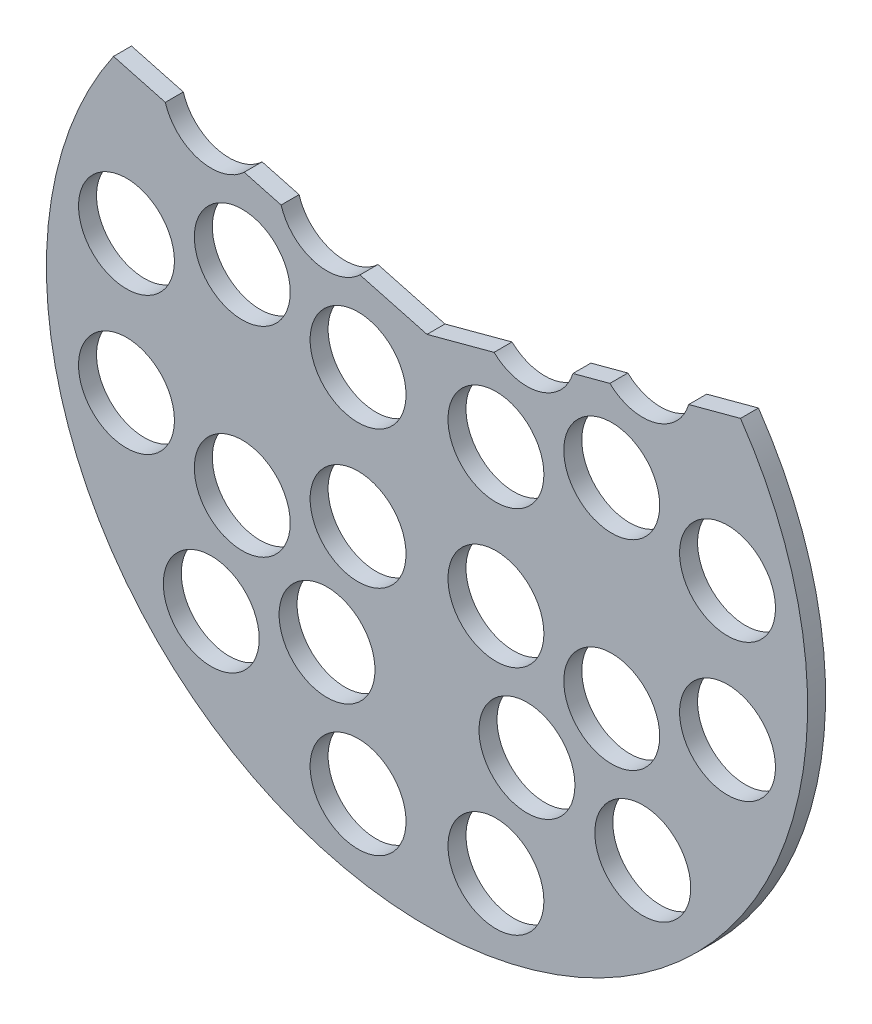
ISO-10303-21;
HEADER;
FILE_DESCRIPTION(('STEP AP214'),'2;1');
FILE_NAME('part.step','',(''),(''),'','','');
FILE_SCHEMA(('AUTOMOTIVE_DESIGN { 1 0 10303 214 1 1 1 1 }'));
ENDSEC;
DATA;
#1=APPLICATION_CONTEXT('core data for automotive mechanical design processes');
#2=APPLICATION_PROTOCOL_DEFINITION('international standard','automotive_design',2000,#1);
#3=PRODUCT_CONTEXT('',#1,'mechanical');
#4=PRODUCT('Part','Part','',(#3));
#5=PRODUCT_RELATED_PRODUCT_CATEGORY('part','',(#4));
#6=PRODUCT_DEFINITION_FORMATION('','',#4);
#7=PRODUCT_DEFINITION_CONTEXT('part definition',#1,'design');
#8=PRODUCT_DEFINITION('design','',#6,#7);
#9=PRODUCT_DEFINITION_SHAPE('','',#8);
#10=(LENGTH_UNIT() NAMED_UNIT(*) SI_UNIT(.MILLI.,.METRE.));
#11=(NAMED_UNIT(*) PLANE_ANGLE_UNIT() SI_UNIT($,.RADIAN.));
#12=(NAMED_UNIT(*) SI_UNIT($,.STERADIAN.) SOLID_ANGLE_UNIT());
#13=UNCERTAINTY_MEASURE_WITH_UNIT(LENGTH_MEASURE(1.E-05),#10,'distance_accuracy_value','');
#14=(GEOMETRIC_REPRESENTATION_CONTEXT(3) GLOBAL_UNCERTAINTY_ASSIGNED_CONTEXT((#13)) GLOBAL_UNIT_ASSIGNED_CONTEXT((#10,
#11,#12)) REPRESENTATION_CONTEXT('',''));
#15=CARTESIAN_POINT('',(0.,0.,0.));
#16=DIRECTION('',(0.,0.,1.));
#17=DIRECTION('',(1.,0.,0.));
#18=AXIS2_PLACEMENT_3D('',#15,#16,#17);
#19=CARTESIAN_POINT('',(0.,0.,1.5));
#20=DIRECTION('',(0.,0.,1.));
#21=DIRECTION('',(1.,0.,0.));
#22=AXIS2_PLACEMENT_3D('',#19,#20,#21);
#23=PLANE('',#22);
#24=CARTESIAN_POINT('',(-25.0684769508544,5.74996042511669,1.5));
#25=DIRECTION('',(0.,0.,1.));
#26=DIRECTION('',(1.,0.,0.));
#27=AXIS2_PLACEMENT_3D('',#24,#25,#26);
#28=CIRCLE('',#27,3.99999999999999);
#29=CARTESIAN_POINT('',(-21.0684769508544,5.74996042511669,1.5));
#30=VERTEX_POINT('',#29);
#31=EDGE_CURVE('E216',#30,#30,#28,.T.);
#32=ORIENTED_EDGE('',*,*,#31,.F.);
#33=EDGE_LOOP('',(#32));
#34=FACE_BOUND('',#33,.T.);
#35=CARTESIAN_POINT('',(-15.4092186879601,8.33815087612825,1.5));
#36=DIRECTION('',(0.,0.,1.));
#37=DIRECTION('',(1.,0.,0.));
#38=AXIS2_PLACEMENT_3D('',#35,#36,#37);
#39=CIRCLE('',#38,4.);
#40=CARTESIAN_POINT('',(-11.4092186879601,8.33815087612825,1.5));
#41=VERTEX_POINT('',#40);
#42=EDGE_CURVE('E220',#41,#41,#39,.T.);
#43=ORIENTED_EDGE('',*,*,#42,.F.);
#44=EDGE_LOOP('',(#43));
#45=FACE_BOUND('',#44,.T.);
#46=CARTESIAN_POINT('',(-5.74992085018606,-25.0685165257759,1.5));
#47=DIRECTION('',(0.,0.,1.));
#48=DIRECTION('',(1.,0.,0.));
#49=AXIS2_PLACEMENT_3D('',#46,#47,#48);
#50=CIRCLE('',#49,4.00000000000001);
#51=CARTESIAN_POINT('',(-1.74992085018605,-25.0685165257759,1.5));
#52=VERTEX_POINT('',#51);
#53=EDGE_CURVE('E224',#52,#52,#50,.T.);
#54=ORIENTED_EDGE('',*,*,#53,.F.);
#55=EDGE_LOOP('',(#54));
#56=FACE_BOUND('',#55,.T.);
#57=CARTESIAN_POINT('',(-15.409179113061,-8.33819045101063,1.5));
#58=DIRECTION('',(0.,0.,1.));
#59=DIRECTION('',(1.,0.,0.));
#60=AXIS2_PLACEMENT_3D('',#57,#58,#59);
#61=CIRCLE('',#60,3.99999999999999);
#62=CARTESIAN_POINT('',(-11.409179113061,-8.33819045101063,1.5));
#63=VERTEX_POINT('',#62);
#64=EDGE_CURVE('E228',#63,#63,#61,.T.);
#65=ORIENTED_EDGE('',*,*,#64,.F.);
#66=EDGE_LOOP('',(#65));
#67=FACE_BOUND('',#66,.T.);
#68=CARTESIAN_POINT('',(-8.33811130120218,-15.4092582628828,1.5));
#69=DIRECTION('',(0.,0.,1.));
#70=DIRECTION('',(1.,0.,0.));
#71=AXIS2_PLACEMENT_3D('',#68,#69,#70);
#72=CIRCLE('',#71,4.);
#73=CARTESIAN_POINT('',(-4.33811130120218,-15.4092582628828,1.5));
#74=VERTEX_POINT('',#73);
#75=EDGE_CURVE('E232',#74,#74,#72,.T.);
#76=ORIENTED_EDGE('',*,*,#75,.F.);
#77=EDGE_LOOP('',(#76));
#78=FACE_BOUND('',#77,.T.);
#79=CARTESIAN_POINT('',(25.0685561006974,-5.74996042509303,1.5));
#80=DIRECTION('',(0.,0.,1.));
#81=DIRECTION('',(1.,0.,0.));
#82=AXIS2_PLACEMENT_3D('',#79,#80,#81);
#83=CIRCLE('',#82,4.00000000000003);
#84=CARTESIAN_POINT('',(29.0685561006975,-5.74996042509303,1.5));
#85=VERTEX_POINT('',#84);
#86=EDGE_CURVE('E236',#85,#85,#83,.T.);
#87=ORIENTED_EDGE('',*,*,#86,.F.);
#88=EDGE_LOOP('',(#87));
#89=FACE_BOUND('',#88,.T.);
#90=CARTESIAN_POINT('',(8.3382300259367,-15.4092186879758,1.5));
#91=DIRECTION('',(0.,0.,1.));
#92=DIRECTION('',(1.,0.,0.));
#93=AXIS2_PLACEMENT_3D('',#90,#91,#92);
#94=CIRCLE('',#93,4.);
#95=CARTESIAN_POINT('',(12.3382300259367,-15.4092186879758,1.5));
#96=VERTEX_POINT('',#95);
#97=EDGE_CURVE('E240',#96,#96,#94,.T.);
#98=ORIENTED_EDGE('',*,*,#97,.F.);
#99=EDGE_LOOP('',(#98));
#100=FACE_BOUND('',#99,.T.);
#101=CARTESIAN_POINT('',(15.4092978378055,-8.33815087611371,1.5));
#102=DIRECTION('',(0.,0.,1.));
#103=DIRECTION('',(1.,0.,0.));
#104=AXIS2_PLACEMENT_3D('',#101,#102,#103);
#105=CIRCLE('',#104,3.99999999999999);
#106=CARTESIAN_POINT('',(19.4092978378055,-8.33815087611371,1.5));
#107=VERTEX_POINT('',#106);
#108=EDGE_CURVE('E244',#107,#107,#105,.T.);
#109=ORIENTED_EDGE('',*,*,#108,.F.);
#110=EDGE_LOOP('',(#109));
#111=FACE_BOUND('',#110,.T.);
#112=CARTESIAN_POINT('',(15.4092582628907,8.33819045102517,1.5));
#113=DIRECTION('',(0.,0.,1.));
#114=DIRECTION('',(1.,0.,0.));
#115=AXIS2_PLACEMENT_3D('',#112,#113,#114);
#116=CIRCLE('',#115,3.99999999999999);
#117=CARTESIAN_POINT('',(19.4092582628907,8.33819045102517,1.5));
#118=VERTEX_POINT('',#117);
#119=EDGE_CURVE('E175',#118,#118,#116,.T.);
#120=ORIENTED_EDGE('',*,*,#119,.F.);
#121=EDGE_LOOP('',(#120));
#122=FACE_BOUND('',#121,.T.);
#123=CARTESIAN_POINT('',(5.75,5.75,1.5));
#124=DIRECTION('',(0.,0.,1.));
#125=DIRECTION('',(1.,0.,0.));
#126=AXIS2_PLACEMENT_3D('',#123,#124,#125);
#127=CIRCLE('',#126,4.);
#128=CARTESIAN_POINT('',(9.75,5.75,1.5));
#129=VERTEX_POINT('',#128);
#130=EDGE_CURVE('E152',#129,#129,#127,.T.);
#131=ORIENTED_EDGE('',*,*,#130,.F.);
#132=EDGE_LOOP('',(#131));
#133=FACE_BOUND('',#132,.T.);
#134=CARTESIAN_POINT('',(25.0685165257814,5.75,1.5));
#135=DIRECTION('',(0.,0.,1.));
#136=DIRECTION('',(1.,0.,0.));
#137=AXIS2_PLACEMENT_3D('',#134,#135,#136);
#138=CIRCLE('',#137,4.00000000000003);
#139=CARTESIAN_POINT('',(29.0685165257814,5.75,1.5));
#140=VERTEX_POINT('',#139);
#141=EDGE_CURVE('E252',#140,#140,#138,.T.);
#142=ORIENTED_EDGE('',*,*,#141,.F.);
#143=EDGE_LOOP('',(#142));
#144=FACE_BOUND('',#143,.T.);
#145=CARTESIAN_POINT('',(5.75003957491608,-5.74996042508392,1.5));
#146=DIRECTION('',(0.,0.,1.));
#147=DIRECTION('',(1.,0.,0.));
#148=AXIS2_PLACEMENT_3D('',#145,#146,#147);
#149=CIRCLE('',#148,3.99999999999999);
#150=CARTESIAN_POINT('',(9.75003957491608,-5.74996042508392,1.5));
#151=VERTEX_POINT('',#150);
#152=EDGE_CURVE('E256',#151,#151,#149,.T.);
#153=ORIENTED_EDGE('',*,*,#152,.F.);
#154=EDGE_LOOP('',(#153));
#155=FACE_BOUND('',#154,.T.);
#156=CARTESIAN_POINT('',(17.9974882888262,-17.9974091390056,1.5));
#157=DIRECTION('',(0.,0.,1.));
#158=DIRECTION('',(1.,0.,0.));
#159=AXIS2_PLACEMENT_3D('',#156,#157,#158);
#160=CIRCLE('',#159,3.99999999999999);
#161=CARTESIAN_POINT('',(21.9974882888261,-17.9974091390056,1.5));
#162=VERTEX_POINT('',#161);
#163=EDGE_CURVE('E260',#162,#162,#160,.T.);
#164=ORIENTED_EDGE('',*,*,#163,.F.);
#165=EDGE_LOOP('',(#164));
#166=FACE_BOUND('',#165,.T.);
#167=CARTESIAN_POINT('',(5.75003957490697,-25.0684769508653,1.5));
#168=DIRECTION('',(0.,0.,1.));
#169=DIRECTION('',(1.,0.,0.));
#170=AXIS2_PLACEMENT_3D('',#167,#168,#169);
#171=CIRCLE('',#170,4.00000000000001);
#172=CARTESIAN_POINT('',(9.75003957490698,-25.0684769508653,1.5));
#173=VERTEX_POINT('',#172);
#174=EDGE_CURVE('E264',#173,#173,#171,.T.);
#175=ORIENTED_EDGE('',*,*,#174,.F.);
#176=EDGE_LOOP('',(#175));
#177=FACE_BOUND('',#176,.T.);
#178=CARTESIAN_POINT('',(-5.74992085016783,-5.74999999999457,1.5));
#179=DIRECTION('',(0.,0.,1.));
#180=DIRECTION('',(1.,0.,0.));
#181=AXIS2_PLACEMENT_3D('',#178,#179,#180);
#182=CIRCLE('',#181,4.);
#183=CARTESIAN_POINT('',(-1.74992085016783,-5.74999999999457,1.5));
#184=VERTEX_POINT('',#183);
#185=EDGE_CURVE('E268',#184,#184,#182,.T.);
#186=ORIENTED_EDGE('',*,*,#185,.F.);
#187=EDGE_LOOP('',(#186));
#188=FACE_BOUND('',#187,.T.);
#189=CARTESIAN_POINT('',(-17.9973695640953,-17.9974487138989,1.5));
#190=DIRECTION('',(0.,0.,1.));
#191=DIRECTION('',(1.,0.,0.));
#192=AXIS2_PLACEMENT_3D('',#189,#190,#191);
#193=CIRCLE('',#192,4.);
#194=CARTESIAN_POINT('',(-13.9973695640953,-17.9974487138989,1.5));
#195=VERTEX_POINT('',#194);
#196=EDGE_CURVE('E272',#195,#195,#193,.T.);
#197=ORIENTED_EDGE('',*,*,#196,.F.);
#198=EDGE_LOOP('',(#197));
#199=FACE_BOUND('',#198,.T.);
#200=CARTESIAN_POINT('',(-25.0684373759492,-5.74999999997635,1.5));
#201=DIRECTION('',(0.,0.,1.));
#202=DIRECTION('',(1.,0.,0.));
#203=AXIS2_PLACEMENT_3D('',#200,#201,#202);
#204=CIRCLE('',#203,3.99999999999999);
#205=CARTESIAN_POINT('',(-21.0684373759492,-5.74999999997635,1.5));
#206=VERTEX_POINT('',#205);
#207=EDGE_CURVE('E276',#206,#206,#204,.T.);
#208=ORIENTED_EDGE('',*,*,#207,.F.);
#209=EDGE_LOOP('',(#208));
#210=FACE_BOUND('',#209,.T.);
#211=CARTESIAN_POINT('',(-5.74996042507306,5.74996042508934,1.5));
#212=DIRECTION('',(0.,0.,1.));
#213=DIRECTION('',(1.,0.,0.));
#214=AXIS2_PLACEMENT_3D('',#211,#212,#213);
#215=CIRCLE('',#214,4.);
#216=CARTESIAN_POINT('',(-1.74996042507306,5.74996042508934,1.5));
#217=VERTEX_POINT('',#216);
#218=EDGE_CURVE('E279',#217,#217,#215,.T.);
#219=ORIENTED_EDGE('',*,*,#218,.F.);
#220=EDGE_LOOP('',(#219));
#221=FACE_BOUND('',#220,.T.);
#222=CARTESIAN_POINT('',(-8.33815087608457,15.4092186879837,1.5));
#223=DIRECTION('',(0.,0.,1.));
#224=DIRECTION('',(1.,0.,0.));
#225=AXIS2_PLACEMENT_3D('',#222,#223,#224);
#226=CIRCLE('',#225,4.);
#227=CARTESIAN_POINT('',(-12.1697718795866,14.2608805472247,1.5));
#228=VERTEX_POINT('',#227);
#229=CARTESIAN_POINT('',(-5.59403881976548,12.498918184193,1.5));
#230=VERTEX_POINT('',#229);
#231=EDGE_CURVE('E399',#228,#230,#226,.T.);
#232=ORIENTED_EDGE('',*,*,#231,.F.);
#233=DIRECTION('',(0.965925826288701,-0.258819045103891,0.));
#234=VECTOR('',#233,1.);
#235=CARTESIAN_POINT('',(-26.1498802743356,18.0068393017185,1.5));
#236=LINE('',#235,#234);
#237=CARTESIAN_POINT('',(-15.2532970826525,15.0871086352319,1.5));
#238=VERTEX_POINT('',#237);
#239=EDGE_CURVE('E141',#238,#228,#236,.T.);
#240=ORIENTED_EDGE('',*,*,#239,.F.);
#241=CARTESIAN_POINT('',(-17.9974091389716,17.9974091390226,1.5));
#242=DIRECTION('',(0.,0.,1.));
#243=DIRECTION('',(1.,0.,0.));
#244=AXIS2_PLACEMENT_3D('',#241,#242,#243);
#245=CIRCLE('',#244,4.);
#246=CARTESIAN_POINT('',(-21.8290301424737,16.8490709982636,1.5));
#247=VERTEX_POINT('',#246);
#248=EDGE_CURVE('E139',#247,#238,#245,.T.);
#249=ORIENTED_EDGE('',*,*,#248,.F.);
#250=CARTESIAN_POINT('',(-26.1498802743356,18.0068393017185,1.5));
#251=VERTEX_POINT('',#250);
#252=EDGE_CURVE('E120',#251,#247,#236,.T.);
#253=ORIENTED_EDGE('',*,*,#252,.F.);
#254=CARTESIAN_POINT('',(0.,0.,1.5));
#255=DIRECTION('',(0.,0.,1.));
#256=DIRECTION('',(1.,0.,0.));
#257=AXIS2_PLACEMENT_3D('',#254,#255,#256);
#258=CIRCLE('',#257,31.75);
#259=CARTESIAN_POINT('',(26.1498802743588,18.0068393016849,1.5));
#260=VERTEX_POINT('',#259);
#261=EDGE_CURVE('E136',#251,#260,#258,.T.);
#262=ORIENTED_EDGE('',*,*,#261,.T.);
#263=DIRECTION('',(0.965925826289069,0.258819045102517,0.));
#264=VECTOR('',#263,1.);
#265=CARTESIAN_POINT('',(0.,11.,1.5));
#266=LINE('',#265,#264);
#267=CARTESIAN_POINT('',(21.8290602765594,16.8490790726343,1.5));
#268=VERTEX_POINT('',#267);
#269=EDGE_CURVE('E140',#268,#260,#266,.T.);
#270=ORIENTED_EDGE('',*,*,#269,.F.);
#271=CARTESIAN_POINT('',(17.9974487139159,17.9974487139158,1.5));
#272=DIRECTION('',(0.,0.,1.));
#273=DIRECTION('',(1.,0.,0.));
#274=AXIS2_PLACEMENT_3D('',#271,#272,#273);
#275=CIRCLE('',#274,3.99999999999999);
#276=CARTESIAN_POINT('',(15.2533605838733,15.0871256503095,1.5));
#277=VERTEX_POINT('',#276);
#278=EDGE_CURVE('E164',#277,#268,#275,.T.);
#279=ORIENTED_EDGE('',*,*,#278,.F.);
#280=CARTESIAN_POINT('',(12.1698020136687,14.2608886216091,1.5));
#281=VERTEX_POINT('',#280);
#282=EDGE_CURVE('E58',#281,#277,#266,.T.);
#283=ORIENTED_EDGE('',*,*,#282,.F.);
#284=CARTESIAN_POINT('',(8.33819045102524,15.4092582628907,1.5));
#285=DIRECTION('',(0.,0.,1.));
#286=DIRECTION('',(1.,0.,0.));
#287=AXIS2_PLACEMENT_3D('',#284,#285,#286);
#288=CIRCLE('',#287,4.00000000000001);
#289=CARTESIAN_POINT('',(5.59410232098258,12.4989351992843,1.5));
#290=VERTEX_POINT('',#289);
#291=EDGE_CURVE('E173',#290,#281,#288,.T.);
#292=ORIENTED_EDGE('',*,*,#291,.F.);
#293=CARTESIAN_POINT('',(0.,11.,1.5));
#294=VERTEX_POINT('',#293);
#295=EDGE_CURVE('E373',#294,#290,#266,.T.);
#296=ORIENTED_EDGE('',*,*,#295,.F.);
#297=EDGE_CURVE('E143',#230,#294,#236,.T.);
#298=ORIENTED_EDGE('',*,*,#297,.F.);
#299=EDGE_LOOP('',(#232,#240,#249,#253,#262,#270,#279,#283,#292,#296,#298));
#300=FACE_BOUND('',#299,.T.);
#301=ADVANCED_FACE('F36',(#34,#45,#56,#67,#78,#89,#100,#111,#122,#133,#144,#155,#166,#177,#188,
#199,#210,#221,#300),#23,.T.);
#302=CARTESIAN_POINT('',(0.,0.,0.));
#303=DIRECTION('',(0.,0.,1.));
#304=DIRECTION('',(1.,0.,0.));
#305=AXIS2_PLACEMENT_3D('',#302,#303,#304);
#306=PLANE('',#305);
#307=CARTESIAN_POINT('',(-25.0684769508544,5.74996042511669,0.));
#308=DIRECTION('',(0.,0.,1.));
#309=DIRECTION('',(1.,0.,0.));
#310=AXIS2_PLACEMENT_3D('',#307,#308,#309);
#311=CIRCLE('',#310,3.99999999999999);
#312=CARTESIAN_POINT('',(-21.0684769508544,5.74996042511669,0.));
#313=VERTEX_POINT('',#312);
#314=EDGE_CURVE('E394',#313,#313,#311,.T.);
#315=ORIENTED_EDGE('',*,*,#314,.T.);
#316=EDGE_LOOP('',(#315));
#317=FACE_BOUND('',#316,.T.);
#318=CARTESIAN_POINT('',(-15.4092186879601,8.33815087612825,0.));
#319=DIRECTION('',(0.,0.,1.));
#320=DIRECTION('',(1.,0.,0.));
#321=AXIS2_PLACEMENT_3D('',#318,#319,#320);
#322=CIRCLE('',#321,4.);
#323=CARTESIAN_POINT('',(-11.4092186879601,8.33815087612825,0.));
#324=VERTEX_POINT('',#323);
#325=EDGE_CURVE('E289',#324,#324,#322,.T.);
#326=ORIENTED_EDGE('',*,*,#325,.T.);
#327=EDGE_LOOP('',(#326));
#328=FACE_BOUND('',#327,.T.);
#329=CARTESIAN_POINT('',(-5.74996042507306,5.74996042508934,0.));
#330=DIRECTION('',(0.,0.,1.));
#331=DIRECTION('',(1.,0.,0.));
#332=AXIS2_PLACEMENT_3D('',#329,#330,#331);
#333=CIRCLE('',#332,4.);
#334=CARTESIAN_POINT('',(-1.74996042507306,5.74996042508934,0.));
#335=VERTEX_POINT('',#334);
#336=EDGE_CURVE('E282',#335,#335,#333,.T.);
#337=ORIENTED_EDGE('',*,*,#336,.T.);
#338=EDGE_LOOP('',(#337));
#339=FACE_BOUND('',#338,.T.);
#340=CARTESIAN_POINT('',(-5.74992085018606,-25.0685165257759,0.));
#341=DIRECTION('',(0.,0.,1.));
#342=DIRECTION('',(1.,0.,0.));
#343=AXIS2_PLACEMENT_3D('',#340,#341,#342);
#344=CIRCLE('',#343,4.00000000000001);
#345=CARTESIAN_POINT('',(-1.74992085018605,-25.0685165257759,0.));
#346=VERTEX_POINT('',#345);
#347=EDGE_CURVE('E281',#346,#346,#344,.T.);
#348=ORIENTED_EDGE('',*,*,#347,.T.);
#349=EDGE_LOOP('',(#348));
#350=FACE_BOUND('',#349,.T.);
#351=CARTESIAN_POINT('',(-25.0684373759492,-5.74999999997635,0.));
#352=DIRECTION('',(0.,0.,1.));
#353=DIRECTION('',(1.,0.,0.));
#354=AXIS2_PLACEMENT_3D('',#351,#352,#353);
#355=CIRCLE('',#354,3.99999999999999);
#356=CARTESIAN_POINT('',(-21.0684373759492,-5.74999999997635,0.));
#357=VERTEX_POINT('',#356);
#358=EDGE_CURVE('E292',#357,#357,#355,.T.);
#359=ORIENTED_EDGE('',*,*,#358,.T.);
#360=EDGE_LOOP('',(#359));
#361=FACE_BOUND('',#360,.T.);
#362=CARTESIAN_POINT('',(-15.409179113061,-8.33819045101063,0.));
#363=DIRECTION('',(0.,0.,1.));
#364=DIRECTION('',(1.,0.,0.));
#365=AXIS2_PLACEMENT_3D('',#362,#363,#364);
#366=CIRCLE('',#365,3.99999999999999);
#367=CARTESIAN_POINT('',(-11.409179113061,-8.33819045101063,0.));
#368=VERTEX_POINT('',#367);
#369=EDGE_CURVE('E295',#368,#368,#366,.T.);
#370=ORIENTED_EDGE('',*,*,#369,.T.);
#371=EDGE_LOOP('',(#370));
#372=FACE_BOUND('',#371,.T.);
#373=CARTESIAN_POINT('',(-17.9973695640953,-17.9974487138989,0.));
#374=DIRECTION('',(0.,0.,1.));
#375=DIRECTION('',(1.,0.,0.));
#376=AXIS2_PLACEMENT_3D('',#373,#374,#375);
#377=CIRCLE('',#376,4.);
#378=CARTESIAN_POINT('',(-13.9973695640953,-17.9974487138989,0.));
#379=VERTEX_POINT('',#378);
#380=EDGE_CURVE('E299',#379,#379,#377,.T.);
#381=ORIENTED_EDGE('',*,*,#380,.T.);
#382=EDGE_LOOP('',(#381));
#383=FACE_BOUND('',#382,.T.);
#384=CARTESIAN_POINT('',(-8.33811130120218,-15.4092582628828,0.));
#385=DIRECTION('',(0.,0.,1.));
#386=DIRECTION('',(1.,0.,0.));
#387=AXIS2_PLACEMENT_3D('',#384,#385,#386);
#388=CIRCLE('',#387,4.);
#389=CARTESIAN_POINT('',(-4.33811130120218,-15.4092582628828,0.));
#390=VERTEX_POINT('',#389);
#391=EDGE_CURVE('E303',#390,#390,#388,.T.);
#392=ORIENTED_EDGE('',*,*,#391,.T.);
#393=EDGE_LOOP('',(#392));
#394=FACE_BOUND('',#393,.T.);
#395=CARTESIAN_POINT('',(-5.74992085016783,-5.74999999999457,0.));
#396=DIRECTION('',(0.,0.,1.));
#397=DIRECTION('',(1.,0.,0.));
#398=AXIS2_PLACEMENT_3D('',#395,#396,#397);
#399=CIRCLE('',#398,4.);
#400=CARTESIAN_POINT('',(-1.74992085016783,-5.74999999999457,0.));
#401=VERTEX_POINT('',#400);
#402=EDGE_CURVE('E307',#401,#401,#399,.T.);
#403=ORIENTED_EDGE('',*,*,#402,.T.);
#404=EDGE_LOOP('',(#403));
#405=FACE_BOUND('',#404,.T.);
#406=CARTESIAN_POINT('',(25.0685561006974,-5.74996042509303,0.));
#407=DIRECTION('',(0.,0.,1.));
#408=DIRECTION('',(1.,0.,0.));
#409=AXIS2_PLACEMENT_3D('',#406,#407,#408);
#410=CIRCLE('',#409,4.00000000000003);
#411=CARTESIAN_POINT('',(29.0685561006975,-5.74996042509303,0.));
#412=VERTEX_POINT('',#411);
#413=EDGE_CURVE('E311',#412,#412,#410,.T.);
#414=ORIENTED_EDGE('',*,*,#413,.T.);
#415=EDGE_LOOP('',(#414));
#416=FACE_BOUND('',#415,.T.);
#417=CARTESIAN_POINT('',(5.75003957490697,-25.0684769508653,0.));
#418=DIRECTION('',(0.,0.,1.));
#419=DIRECTION('',(1.,0.,0.));
#420=AXIS2_PLACEMENT_3D('',#417,#418,#419);
#421=CIRCLE('',#420,4.00000000000001);
#422=CARTESIAN_POINT('',(9.75003957490698,-25.0684769508653,0.));
#423=VERTEX_POINT('',#422);
#424=EDGE_CURVE('E315',#423,#423,#421,.T.);
#425=ORIENTED_EDGE('',*,*,#424,.T.);
#426=EDGE_LOOP('',(#425));
#427=FACE_BOUND('',#426,.T.);
#428=CARTESIAN_POINT('',(8.3382300259367,-15.4092186879758,0.));
#429=DIRECTION('',(0.,0.,1.));
#430=DIRECTION('',(1.,0.,0.));
#431=AXIS2_PLACEMENT_3D('',#428,#429,#430);
#432=CIRCLE('',#431,4.);
#433=CARTESIAN_POINT('',(12.3382300259367,-15.4092186879758,0.));
#434=VERTEX_POINT('',#433);
#435=EDGE_CURVE('E319',#434,#434,#432,.T.);
#436=ORIENTED_EDGE('',*,*,#435,.T.);
#437=EDGE_LOOP('',(#436));
#438=FACE_BOUND('',#437,.T.);
#439=CARTESIAN_POINT('',(17.9974882888262,-17.9974091390056,0.));
#440=DIRECTION('',(0.,0.,1.));
#441=DIRECTION('',(1.,0.,0.));
#442=AXIS2_PLACEMENT_3D('',#439,#440,#441);
#443=CIRCLE('',#442,3.99999999999999);
#444=CARTESIAN_POINT('',(21.9974882888261,-17.9974091390056,0.));
#445=VERTEX_POINT('',#444);
#446=EDGE_CURVE('E323',#445,#445,#443,.T.);
#447=ORIENTED_EDGE('',*,*,#446,.T.);
#448=EDGE_LOOP('',(#447));
#449=FACE_BOUND('',#448,.T.);
#450=CARTESIAN_POINT('',(15.4092978378055,-8.33815087611371,0.));
#451=DIRECTION('',(0.,0.,1.));
#452=DIRECTION('',(1.,0.,0.));
#453=AXIS2_PLACEMENT_3D('',#450,#451,#452);
#454=CIRCLE('',#453,3.99999999999999);
#455=CARTESIAN_POINT('',(19.4092978378055,-8.33815087611371,0.));
#456=VERTEX_POINT('',#455);
#457=EDGE_CURVE('E327',#456,#456,#454,.T.);
#458=ORIENTED_EDGE('',*,*,#457,.T.);
#459=EDGE_LOOP('',(#458));
#460=FACE_BOUND('',#459,.T.);
#461=CARTESIAN_POINT('',(5.75003957491608,-5.74996042508392,0.));
#462=DIRECTION('',(0.,0.,1.));
#463=DIRECTION('',(1.,0.,0.));
#464=AXIS2_PLACEMENT_3D('',#461,#462,#463);
#465=CIRCLE('',#464,3.99999999999999);
#466=CARTESIAN_POINT('',(9.75003957491608,-5.74996042508392,0.));
#467=VERTEX_POINT('',#466);
#468=EDGE_CURVE('E331',#467,#467,#465,.T.);
#469=ORIENTED_EDGE('',*,*,#468,.T.);
#470=EDGE_LOOP('',(#469));
#471=FACE_BOUND('',#470,.T.);
#472=CARTESIAN_POINT('',(25.0685165257814,5.75,0.));
#473=DIRECTION('',(0.,0.,1.));
#474=DIRECTION('',(1.,0.,0.));
#475=AXIS2_PLACEMENT_3D('',#472,#473,#474);
#476=CIRCLE('',#475,4.00000000000003);
#477=CARTESIAN_POINT('',(29.0685165257814,5.75,0.));
#478=VERTEX_POINT('',#477);
#479=EDGE_CURVE('E335',#478,#478,#476,.T.);
#480=ORIENTED_EDGE('',*,*,#479,.T.);
#481=EDGE_LOOP('',(#480));
#482=FACE_BOUND('',#481,.T.);
#483=CARTESIAN_POINT('',(15.4092582628907,8.33819045102517,0.));
#484=DIRECTION('',(0.,0.,1.));
#485=DIRECTION('',(1.,0.,0.));
#486=AXIS2_PLACEMENT_3D('',#483,#484,#485);
#487=CIRCLE('',#486,3.99999999999999);
#488=CARTESIAN_POINT('',(19.4092582628907,8.33819045102517,0.));
#489=VERTEX_POINT('',#488);
#490=EDGE_CURVE('E178',#489,#489,#487,.T.);
#491=ORIENTED_EDGE('',*,*,#490,.T.);
#492=EDGE_LOOP('',(#491));
#493=FACE_BOUND('',#492,.T.);
#494=CARTESIAN_POINT('',(5.75,5.75,0.));
#495=DIRECTION('',(0.,0.,1.));
#496=DIRECTION('',(1.,0.,0.));
#497=AXIS2_PLACEMENT_3D('',#494,#495,#496);
#498=CIRCLE('',#497,4.);
#499=CARTESIAN_POINT('',(9.75,5.75,0.));
#500=VERTEX_POINT('',#499);
#501=EDGE_CURVE('E155',#500,#500,#498,.T.);
#502=ORIENTED_EDGE('',*,*,#501,.T.);
#503=EDGE_LOOP('',(#502));
#504=FACE_BOUND('',#503,.T.);
#505=DIRECTION('',(0.965925826288701,-0.258819045103891,0.));
#506=VECTOR('',#505,1.);
#507=CARTESIAN_POINT('',(-26.1498802743356,18.0068393017185,0.));
#508=LINE('',#507,#506);
#509=CARTESIAN_POINT('',(-15.2532970826525,15.0871086352319,0.));
#510=VERTEX_POINT('',#509);
#511=CARTESIAN_POINT('',(-12.1697718795866,14.2608805472247,0.));
#512=VERTEX_POINT('',#511);
#513=EDGE_CURVE('E629',#510,#512,#508,.T.);
#514=ORIENTED_EDGE('',*,*,#513,.T.);
#515=CARTESIAN_POINT('',(-8.33815087608457,15.4092186879837,0.));
#516=DIRECTION('',(0.,0.,1.));
#517=DIRECTION('',(1.,0.,0.));
#518=AXIS2_PLACEMENT_3D('',#515,#516,#517);
#519=CIRCLE('',#518,4.);
#520=CARTESIAN_POINT('',(-5.59403881976548,12.498918184193,0.));
#521=VERTEX_POINT('',#520);
#522=EDGE_CURVE('E396',#512,#521,#519,.T.);
#523=ORIENTED_EDGE('',*,*,#522,.T.);
#524=CARTESIAN_POINT('',(0.,11.,0.));
#525=VERTEX_POINT('',#524);
#526=EDGE_CURVE('E627',#521,#525,#508,.T.);
#527=ORIENTED_EDGE('',*,*,#526,.T.);
#528=DIRECTION('',(0.965925826289069,0.258819045102517,0.));
#529=VECTOR('',#528,1.);
#530=CARTESIAN_POINT('',(0.,11.,0.));
#531=LINE('',#530,#529);
#532=CARTESIAN_POINT('',(5.59410232098258,12.4989351992843,0.));
#533=VERTEX_POINT('',#532);
#534=EDGE_CURVE('E384',#525,#533,#531,.T.);
#535=ORIENTED_EDGE('',*,*,#534,.T.);
#536=CARTESIAN_POINT('',(8.33819045102524,15.4092582628907,0.));
#537=DIRECTION('',(0.,0.,1.));
#538=DIRECTION('',(1.,0.,0.));
#539=AXIS2_PLACEMENT_3D('',#536,#537,#538);
#540=CIRCLE('',#539,4.00000000000001);
#541=CARTESIAN_POINT('',(12.1698020136687,14.2608886216091,0.));
#542=VERTEX_POINT('',#541);
#543=EDGE_CURVE('E170',#533,#542,#540,.T.);
#544=ORIENTED_EDGE('',*,*,#543,.T.);
#545=CARTESIAN_POINT('',(15.2533605838733,15.0871256503095,0.));
#546=VERTEX_POINT('',#545);
#547=EDGE_CURVE('E382',#542,#546,#531,.T.);
#548=ORIENTED_EDGE('',*,*,#547,.T.);
#549=CARTESIAN_POINT('',(17.9974487139159,17.9974487139158,0.));
#550=DIRECTION('',(0.,0.,1.));
#551=DIRECTION('',(1.,0.,0.));
#552=AXIS2_PLACEMENT_3D('',#549,#550,#551);
#553=CIRCLE('',#552,3.99999999999999);
#554=CARTESIAN_POINT('',(21.8290602765594,16.8490790726343,0.));
#555=VERTEX_POINT('',#554);
#556=EDGE_CURVE('E166',#546,#555,#553,.T.);
#557=ORIENTED_EDGE('',*,*,#556,.T.);
#558=CARTESIAN_POINT('',(26.1498802743588,18.0068393016849,0.));
#559=VERTEX_POINT('',#558);
#560=EDGE_CURVE('E51',#555,#559,#531,.T.);
#561=ORIENTED_EDGE('',*,*,#560,.T.);
#562=CARTESIAN_POINT('',(0.,0.,0.));
#563=DIRECTION('',(0.,0.,1.));
#564=DIRECTION('',(1.,0.,0.));
#565=AXIS2_PLACEMENT_3D('',#562,#563,#564);
#566=CIRCLE('',#565,31.75);
#567=CARTESIAN_POINT('',(-26.1498802743356,18.0068393017185,0.));
#568=VERTEX_POINT('',#567);
#569=EDGE_CURVE('E147',#568,#559,#566,.T.);
#570=ORIENTED_EDGE('',*,*,#569,.F.);
#571=CARTESIAN_POINT('',(-21.8290301424737,16.8490709982636,0.));
#572=VERTEX_POINT('',#571);
#573=EDGE_CURVE('E123',#568,#572,#508,.T.);
#574=ORIENTED_EDGE('',*,*,#573,.T.);
#575=CARTESIAN_POINT('',(-17.9974091389716,17.9974091390226,0.));
#576=DIRECTION('',(0.,0.,1.));
#577=DIRECTION('',(1.,0.,0.));
#578=AXIS2_PLACEMENT_3D('',#575,#576,#577);
#579=CIRCLE('',#578,4.);
#580=EDGE_CURVE('E401',#572,#510,#579,.T.);
#581=ORIENTED_EDGE('',*,*,#580,.T.);
#582=EDGE_LOOP('',(#514,#523,#527,#535,#544,#548,#557,#561,#570,#574,#581));
#583=FACE_BOUND('',#582,.T.);
#584=ADVANCED_FACE('F187',(#317,#328,#339,#350,#361,#372,#383,#394,#405,#416,#427,#438,#449,
#460,#471,#482,#493,#504,#583),#306,.F.);
#585=CARTESIAN_POINT('',(0.,0.,1.5));
#586=DIRECTION('',(0.,0.,-1.));
#587=DIRECTION('',(-1.,0.,0.));
#588=AXIS2_PLACEMENT_3D('',#585,#586,#587);
#589=CYLINDRICAL_SURFACE('',#588,31.75);
#590=DIRECTION('',(0.,0.,-1.));
#591=VECTOR('',#590,1.);
#592=CARTESIAN_POINT('',(-26.1498802743356,18.0068393017185,1.5));
#593=LINE('',#592,#591);
#594=EDGE_CURVE('E117',#251,#568,#593,.T.);
#595=ORIENTED_EDGE('',*,*,#594,.T.);
#596=ORIENTED_EDGE('',*,*,#569,.T.);
#597=DIRECTION('',(0.,0.,-1.));
#598=VECTOR('',#597,1.);
#599=CARTESIAN_POINT('',(26.1498802743588,18.0068393016849,1.5));
#600=LINE('',#599,#598);
#601=EDGE_CURVE('E145',#260,#559,#600,.T.);
#602=ORIENTED_EDGE('',*,*,#601,.F.);
#603=ORIENTED_EDGE('',*,*,#261,.F.);
#604=EDGE_LOOP('',(#595,#596,#602,#603));
#605=FACE_BOUND('',#604,.T.);
#606=ADVANCED_FACE('F38',(#605),#589,.T.);
#607=CARTESIAN_POINT('',(8.33819045102524,15.4092582628907,1.5));
#608=DIRECTION('',(0.,0.,-1.));
#609=DIRECTION('',(-1.,0.,0.));
#610=AXIS2_PLACEMENT_3D('',#607,#608,#609);
#611=CYLINDRICAL_SURFACE('',#610,4.00000000000001);
#612=ORIENTED_EDGE('',*,*,#291,.T.);
#613=DIRECTION('',(0.,0.,-1.));
#614=VECTOR('',#613,1.);
#615=CARTESIAN_POINT('',(12.1698020136687,14.2608886216091,1.5));
#616=LINE('',#615,#614);
#617=EDGE_CURVE('E369',#281,#542,#616,.T.);
#618=ORIENTED_EDGE('',*,*,#617,.T.);
#619=ORIENTED_EDGE('',*,*,#543,.F.);
#620=DIRECTION('',(0.,0.,-1.));
#621=VECTOR('',#620,1.);
#622=CARTESIAN_POINT('',(5.59410232098258,12.4989351992843,1.5));
#623=LINE('',#622,#621);
#624=EDGE_CURVE('E370',#533,#290,#623,.F.);
#625=ORIENTED_EDGE('',*,*,#624,.T.);
#626=EDGE_LOOP('',(#612,#618,#619,#625));
#627=FACE_BOUND('',#626,.T.);
#628=ADVANCED_FACE('F360',(#627),#611,.F.);
#629=CARTESIAN_POINT('',(17.9974487139159,17.9974487139158,1.5));
#630=DIRECTION('',(0.,0.,-1.));
#631=DIRECTION('',(-1.,0.,0.));
#632=AXIS2_PLACEMENT_3D('',#629,#630,#631);
#633=CYLINDRICAL_SURFACE('',#632,3.99999999999999);
#634=ORIENTED_EDGE('',*,*,#278,.T.);
#635=DIRECTION('',(0.,0.,-1.));
#636=VECTOR('',#635,1.);
#637=CARTESIAN_POINT('',(21.8290602765594,16.8490790726343,1.5));
#638=LINE('',#637,#636);
#639=EDGE_CURVE('E11',#268,#555,#638,.T.);
#640=ORIENTED_EDGE('',*,*,#639,.T.);
#641=ORIENTED_EDGE('',*,*,#556,.F.);
#642=DIRECTION('',(0.,0.,-1.));
#643=VECTOR('',#642,1.);
#644=CARTESIAN_POINT('',(15.2533605838733,15.0871256503095,1.5));
#645=LINE('',#644,#643);
#646=EDGE_CURVE('E44',#546,#277,#645,.F.);
#647=ORIENTED_EDGE('',*,*,#646,.T.);
#648=EDGE_LOOP('',(#634,#640,#641,#647));
#649=FACE_BOUND('',#648,.T.);
#650=ADVANCED_FACE('F163',(#649),#633,.F.);
#651=CARTESIAN_POINT('',(-17.9974091389716,17.9974091390226,1.5));
#652=DIRECTION('',(0.,0.,-1.));
#653=DIRECTION('',(-1.,0.,0.));
#654=AXIS2_PLACEMENT_3D('',#651,#652,#653);
#655=CYLINDRICAL_SURFACE('',#654,4.);
#656=ORIENTED_EDGE('',*,*,#248,.T.);
#657=DIRECTION('',(0.,0.,-1.));
#658=VECTOR('',#657,1.);
#659=CARTESIAN_POINT('',(-15.2532970826525,15.0871086352319,1.5));
#660=LINE('',#659,#658);
#661=EDGE_CURVE('E389',#238,#510,#660,.T.);
#662=ORIENTED_EDGE('',*,*,#661,.T.);
#663=ORIENTED_EDGE('',*,*,#580,.F.);
#664=DIRECTION('',(0.,0.,-1.));
#665=VECTOR('',#664,1.);
#666=CARTESIAN_POINT('',(-21.8290301424737,16.8490709982636,1.5));
#667=LINE('',#666,#665);
#668=EDGE_CURVE('E128',#572,#247,#667,.F.);
#669=ORIENTED_EDGE('',*,*,#668,.T.);
#670=EDGE_LOOP('',(#656,#662,#663,#669));
#671=FACE_BOUND('',#670,.T.);
#672=ADVANCED_FACE('F202',(#671),#655,.F.);
#673=CARTESIAN_POINT('',(-8.33815087608457,15.4092186879837,1.5));
#674=DIRECTION('',(0.,0.,-1.));
#675=DIRECTION('',(-1.,0.,0.));
#676=AXIS2_PLACEMENT_3D('',#673,#674,#675);
#677=CYLINDRICAL_SURFACE('',#676,4.);
#678=ORIENTED_EDGE('',*,*,#231,.T.);
#679=DIRECTION('',(0.,0.,-1.));
#680=VECTOR('',#679,1.);
#681=CARTESIAN_POINT('',(-5.59403881976548,12.498918184193,1.5));
#682=LINE('',#681,#680);
#683=EDGE_CURVE('E150',#230,#521,#682,.T.);
#684=ORIENTED_EDGE('',*,*,#683,.T.);
#685=ORIENTED_EDGE('',*,*,#522,.F.);
#686=DIRECTION('',(0.,0.,-1.));
#687=VECTOR('',#686,1.);
#688=CARTESIAN_POINT('',(-12.1697718795866,14.2608805472247,1.5));
#689=LINE('',#688,#687);
#690=EDGE_CURVE('E146',#512,#228,#689,.F.);
#691=ORIENTED_EDGE('',*,*,#690,.T.);
#692=EDGE_LOOP('',(#678,#684,#685,#691));
#693=FACE_BOUND('',#692,.T.);
#694=ADVANCED_FACE('F193',(#693),#677,.F.);
#695=CARTESIAN_POINT('',(5.75,5.75,1.5));
#696=DIRECTION('',(0.,0.,-1.));
#697=DIRECTION('',(-1.,0.,0.));
#698=AXIS2_PLACEMENT_3D('',#695,#696,#697);
#699=CYLINDRICAL_SURFACE('',#698,4.);
#700=ORIENTED_EDGE('',*,*,#130,.T.);
#701=EDGE_LOOP('',(#700));
#702=FACE_BOUND('',#701,.T.);
#703=ORIENTED_EDGE('',*,*,#501,.F.);
#704=EDGE_LOOP('',(#703));
#705=FACE_BOUND('',#704,.T.);
#706=ADVANCED_FACE('F190',(#702,#705),#699,.F.);
#707=CARTESIAN_POINT('',(15.4092582628907,8.33819045102517,1.5));
#708=DIRECTION('',(0.,0.,-1.));
#709=DIRECTION('',(-1.,0.,0.));
#710=AXIS2_PLACEMENT_3D('',#707,#708,#709);
#711=CYLINDRICAL_SURFACE('',#710,3.99999999999999);
#712=ORIENTED_EDGE('',*,*,#119,.T.);
#713=EDGE_LOOP('',(#712));
#714=FACE_BOUND('',#713,.T.);
#715=ORIENTED_EDGE('',*,*,#490,.F.);
#716=EDGE_LOOP('',(#715));
#717=FACE_BOUND('',#716,.T.);
#718=ADVANCED_FACE('F192',(#714,#717),#711,.F.);
#719=CARTESIAN_POINT('',(25.0685165257814,5.75,1.5));
#720=DIRECTION('',(0.,0.,-1.));
#721=DIRECTION('',(-1.,0.,0.));
#722=AXIS2_PLACEMENT_3D('',#719,#720,#721);
#723=CYLINDRICAL_SURFACE('',#722,4.00000000000003);
#724=ORIENTED_EDGE('',*,*,#141,.T.);
#725=EDGE_LOOP('',(#724));
#726=FACE_BOUND('',#725,.T.);
#727=ORIENTED_EDGE('',*,*,#479,.F.);
#728=EDGE_LOOP('',(#727));
#729=FACE_BOUND('',#728,.T.);
#730=ADVANCED_FACE('F199',(#726,#729),#723,.F.);
#731=CARTESIAN_POINT('',(5.75003957491608,-5.74996042508392,1.5));
#732=DIRECTION('',(0.,0.,-1.));
#733=DIRECTION('',(-1.,0.,0.));
#734=AXIS2_PLACEMENT_3D('',#731,#732,#733);
#735=CYLINDRICAL_SURFACE('',#734,3.99999999999999);
#736=ORIENTED_EDGE('',*,*,#152,.T.);
#737=EDGE_LOOP('',(#736));
#738=FACE_BOUND('',#737,.T.);
#739=ORIENTED_EDGE('',*,*,#468,.F.);
#740=EDGE_LOOP('',(#739));
#741=FACE_BOUND('',#740,.T.);
#742=ADVANCED_FACE('F348',(#738,#741),#735,.F.);
#743=CARTESIAN_POINT('',(15.4092978378055,-8.33815087611371,1.5));
#744=DIRECTION('',(0.,0.,-1.));
#745=DIRECTION('',(-1.,0.,0.));
#746=AXIS2_PLACEMENT_3D('',#743,#744,#745);
#747=CYLINDRICAL_SURFACE('',#746,3.99999999999999);
#748=ORIENTED_EDGE('',*,*,#108,.T.);
#749=EDGE_LOOP('',(#748));
#750=FACE_BOUND('',#749,.T.);
#751=ORIENTED_EDGE('',*,*,#457,.F.);
#752=EDGE_LOOP('',(#751));
#753=FACE_BOUND('',#752,.T.);
#754=ADVANCED_FACE('F354',(#750,#753),#747,.F.);
#755=CARTESIAN_POINT('',(17.9974882888262,-17.9974091390056,1.5));
#756=DIRECTION('',(0.,0.,-1.));
#757=DIRECTION('',(-1.,0.,0.));
#758=AXIS2_PLACEMENT_3D('',#755,#756,#757);
#759=CYLINDRICAL_SURFACE('',#758,3.99999999999999);
#760=ORIENTED_EDGE('',*,*,#163,.T.);
#761=EDGE_LOOP('',(#760));
#762=FACE_BOUND('',#761,.T.);
#763=ORIENTED_EDGE('',*,*,#446,.F.);
#764=EDGE_LOOP('',(#763));
#765=FACE_BOUND('',#764,.T.);
#766=ADVANCED_FACE('F462',(#762,#765),#759,.F.);
#767=CARTESIAN_POINT('',(8.3382300259367,-15.4092186879758,1.5));
#768=DIRECTION('',(0.,0.,-1.));
#769=DIRECTION('',(-1.,0.,0.));
#770=AXIS2_PLACEMENT_3D('',#767,#768,#769);
#771=CYLINDRICAL_SURFACE('',#770,4.);
#772=ORIENTED_EDGE('',*,*,#97,.T.);
#773=EDGE_LOOP('',(#772));
#774=FACE_BOUND('',#773,.T.);
#775=ORIENTED_EDGE('',*,*,#435,.F.);
#776=EDGE_LOOP('',(#775));
#777=FACE_BOUND('',#776,.T.);
#778=ADVANCED_FACE('F458',(#774,#777),#771,.F.);
#779=CARTESIAN_POINT('',(5.75003957490697,-25.0684769508653,1.5));
#780=DIRECTION('',(0.,0.,-1.));
#781=DIRECTION('',(-1.,0.,0.));
#782=AXIS2_PLACEMENT_3D('',#779,#780,#781);
#783=CYLINDRICAL_SURFACE('',#782,4.00000000000001);
#784=ORIENTED_EDGE('',*,*,#174,.T.);
#785=EDGE_LOOP('',(#784));
#786=FACE_BOUND('',#785,.T.);
#787=ORIENTED_EDGE('',*,*,#424,.F.);
#788=EDGE_LOOP('',(#787));
#789=FACE_BOUND('',#788,.T.);
#790=ADVANCED_FACE('F454',(#786,#789),#783,.F.);
#791=CARTESIAN_POINT('',(25.0685561006974,-5.74996042509303,1.5));
#792=DIRECTION('',(0.,0.,-1.));
#793=DIRECTION('',(-1.,0.,0.));
#794=AXIS2_PLACEMENT_3D('',#791,#792,#793);
#795=CYLINDRICAL_SURFACE('',#794,4.00000000000003);
#796=ORIENTED_EDGE('',*,*,#86,.T.);
#797=EDGE_LOOP('',(#796));
#798=FACE_BOUND('',#797,.T.);
#799=ORIENTED_EDGE('',*,*,#413,.F.);
#800=EDGE_LOOP('',(#799));
#801=FACE_BOUND('',#800,.T.);
#802=ADVANCED_FACE('F450',(#798,#801),#795,.F.);
#803=CARTESIAN_POINT('',(-5.74992085016783,-5.74999999999457,1.5));
#804=DIRECTION('',(0.,0.,-1.));
#805=DIRECTION('',(-1.,0.,0.));
#806=AXIS2_PLACEMENT_3D('',#803,#804,#805);
#807=CYLINDRICAL_SURFACE('',#806,4.);
#808=ORIENTED_EDGE('',*,*,#185,.T.);
#809=EDGE_LOOP('',(#808));
#810=FACE_BOUND('',#809,.T.);
#811=ORIENTED_EDGE('',*,*,#402,.F.);
#812=EDGE_LOOP('',(#811));
#813=FACE_BOUND('',#812,.T.);
#814=ADVANCED_FACE('F446',(#810,#813),#807,.F.);
#815=CARTESIAN_POINT('',(-8.33811130120218,-15.4092582628828,1.5));
#816=DIRECTION('',(0.,0.,-1.));
#817=DIRECTION('',(-1.,0.,0.));
#818=AXIS2_PLACEMENT_3D('',#815,#816,#817);
#819=CYLINDRICAL_SURFACE('',#818,4.);
#820=ORIENTED_EDGE('',*,*,#75,.T.);
#821=EDGE_LOOP('',(#820));
#822=FACE_BOUND('',#821,.T.);
#823=ORIENTED_EDGE('',*,*,#391,.F.);
#824=EDGE_LOOP('',(#823));
#825=FACE_BOUND('',#824,.T.);
#826=ADVANCED_FACE('F442',(#822,#825),#819,.F.);
#827=CARTESIAN_POINT('',(-17.9973695640953,-17.9974487138989,1.5));
#828=DIRECTION('',(0.,0.,-1.));
#829=DIRECTION('',(-1.,0.,0.));
#830=AXIS2_PLACEMENT_3D('',#827,#828,#829);
#831=CYLINDRICAL_SURFACE('',#830,4.);
#832=ORIENTED_EDGE('',*,*,#196,.T.);
#833=EDGE_LOOP('',(#832));
#834=FACE_BOUND('',#833,.T.);
#835=ORIENTED_EDGE('',*,*,#380,.F.);
#836=EDGE_LOOP('',(#835));
#837=FACE_BOUND('',#836,.T.);
#838=ADVANCED_FACE('F438',(#834,#837),#831,.F.);
#839=CARTESIAN_POINT('',(-15.409179113061,-8.33819045101063,1.5));
#840=DIRECTION('',(0.,0.,-1.));
#841=DIRECTION('',(-1.,0.,0.));
#842=AXIS2_PLACEMENT_3D('',#839,#840,#841);
#843=CYLINDRICAL_SURFACE('',#842,3.99999999999999);
#844=ORIENTED_EDGE('',*,*,#64,.T.);
#845=EDGE_LOOP('',(#844));
#846=FACE_BOUND('',#845,.T.);
#847=ORIENTED_EDGE('',*,*,#369,.F.);
#848=EDGE_LOOP('',(#847));
#849=FACE_BOUND('',#848,.T.);
#850=ADVANCED_FACE('F434',(#846,#849),#843,.F.);
#851=CARTESIAN_POINT('',(-25.0684373759492,-5.74999999997635,1.5));
#852=DIRECTION('',(0.,0.,-1.));
#853=DIRECTION('',(-1.,0.,0.));
#854=AXIS2_PLACEMENT_3D('',#851,#852,#853);
#855=CYLINDRICAL_SURFACE('',#854,3.99999999999999);
#856=ORIENTED_EDGE('',*,*,#207,.T.);
#857=EDGE_LOOP('',(#856));
#858=FACE_BOUND('',#857,.T.);
#859=ORIENTED_EDGE('',*,*,#358,.F.);
#860=EDGE_LOOP('',(#859));
#861=FACE_BOUND('',#860,.T.);
#862=ADVANCED_FACE('F430',(#858,#861),#855,.F.);
#863=CARTESIAN_POINT('',(-5.74992085018606,-25.0685165257759,1.5));
#864=DIRECTION('',(0.,0.,-1.));
#865=DIRECTION('',(-1.,0.,0.));
#866=AXIS2_PLACEMENT_3D('',#863,#864,#865);
#867=CYLINDRICAL_SURFACE('',#866,4.00000000000001);
#868=ORIENTED_EDGE('',*,*,#53,.T.);
#869=EDGE_LOOP('',(#868));
#870=FACE_BOUND('',#869,.T.);
#871=ORIENTED_EDGE('',*,*,#347,.F.);
#872=EDGE_LOOP('',(#871));
#873=FACE_BOUND('',#872,.T.);
#874=ADVANCED_FACE('F424',(#870,#873),#867,.F.);
#875=CARTESIAN_POINT('',(-5.74996042507306,5.74996042508934,1.5));
#876=DIRECTION('',(0.,0.,-1.));
#877=DIRECTION('',(-1.,0.,0.));
#878=AXIS2_PLACEMENT_3D('',#875,#876,#877);
#879=CYLINDRICAL_SURFACE('',#878,4.);
#880=ORIENTED_EDGE('',*,*,#218,.T.);
#881=EDGE_LOOP('',(#880));
#882=FACE_BOUND('',#881,.T.);
#883=ORIENTED_EDGE('',*,*,#336,.F.);
#884=EDGE_LOOP('',(#883));
#885=FACE_BOUND('',#884,.T.);
#886=ADVANCED_FACE('F415',(#882,#885),#879,.F.);
#887=CARTESIAN_POINT('',(-15.4092186879601,8.33815087612825,1.5));
#888=DIRECTION('',(0.,0.,-1.));
#889=DIRECTION('',(-1.,0.,0.));
#890=AXIS2_PLACEMENT_3D('',#887,#888,#889);
#891=CYLINDRICAL_SURFACE('',#890,4.);
#892=ORIENTED_EDGE('',*,*,#42,.T.);
#893=EDGE_LOOP('',(#892));
#894=FACE_BOUND('',#893,.T.);
#895=ORIENTED_EDGE('',*,*,#325,.F.);
#896=EDGE_LOOP('',(#895));
#897=FACE_BOUND('',#896,.T.);
#898=ADVANCED_FACE('F412',(#894,#897),#891,.F.);
#899=CARTESIAN_POINT('',(-25.0684769508544,5.74996042511669,1.5));
#900=DIRECTION('',(0.,0.,-1.));
#901=DIRECTION('',(-1.,0.,0.));
#902=AXIS2_PLACEMENT_3D('',#899,#900,#901);
#903=CYLINDRICAL_SURFACE('',#902,3.99999999999999);
#904=ORIENTED_EDGE('',*,*,#31,.T.);
#905=EDGE_LOOP('',(#904));
#906=FACE_BOUND('',#905,.T.);
#907=ORIENTED_EDGE('',*,*,#314,.F.);
#908=EDGE_LOOP('',(#907));
#909=FACE_BOUND('',#908,.T.);
#910=ADVANCED_FACE('F414',(#906,#909),#903,.F.);
#911=CARTESIAN_POINT('',(-26.1498802743356,18.0068393017185,1.5));
#912=DIRECTION('',(0.258819045103891,0.965925826288701,0.));
#913=DIRECTION('',(-0.965925826288701,0.258819045103891,0.));
#914=AXIS2_PLACEMENT_3D('',#911,#912,#913);
#915=PLANE('',#914);
#916=ORIENTED_EDGE('',*,*,#239,.T.);
#917=ORIENTED_EDGE('',*,*,#690,.F.);
#918=ORIENTED_EDGE('',*,*,#513,.F.);
#919=ORIENTED_EDGE('',*,*,#661,.F.);
#920=EDGE_LOOP('',(#916,#917,#918,#919));
#921=FACE_BOUND('',#920,.T.);
#922=ADVANCED_FACE('F421',(#921),#915,.T.);
#923=ORIENTED_EDGE('',*,*,#297,.T.);
#924=DIRECTION('',(0.,0.,-1.));
#925=VECTOR('',#924,1.);
#926=CARTESIAN_POINT('',(0.,11.,1.5));
#927=LINE('',#926,#925);
#928=EDGE_CURVE('E129',#294,#525,#927,.T.);
#929=ORIENTED_EDGE('',*,*,#928,.T.);
#930=ORIENTED_EDGE('',*,*,#526,.F.);
#931=ORIENTED_EDGE('',*,*,#683,.F.);
#932=EDGE_LOOP('',(#923,#929,#930,#931));
#933=FACE_BOUND('',#932,.T.);
#934=ADVANCED_FACE('F581',(#933),#915,.T.);
#935=CARTESIAN_POINT('',(0.,11.,1.5));
#936=DIRECTION('',(-0.258819045102517,0.965925826289069,0.));
#937=DIRECTION('',(-0.965925826289069,-0.258819045102517,0.));
#938=AXIS2_PLACEMENT_3D('',#935,#936,#937);
#939=PLANE('',#938);
#940=ORIENTED_EDGE('',*,*,#534,.F.);
#941=ORIENTED_EDGE('',*,*,#928,.F.);
#942=ORIENTED_EDGE('',*,*,#295,.T.);
#943=ORIENTED_EDGE('',*,*,#624,.F.);
#944=EDGE_LOOP('',(#940,#941,#942,#943));
#945=FACE_BOUND('',#944,.T.);
#946=ADVANCED_FACE('F591',(#945),#939,.T.);
#947=ORIENTED_EDGE('',*,*,#573,.F.);
#948=ORIENTED_EDGE('',*,*,#594,.F.);
#949=ORIENTED_EDGE('',*,*,#252,.T.);
#950=ORIENTED_EDGE('',*,*,#668,.F.);
#951=EDGE_LOOP('',(#947,#948,#949,#950));
#952=FACE_BOUND('',#951,.T.);
#953=ADVANCED_FACE('F119',(#952),#915,.T.);
#954=ORIENTED_EDGE('',*,*,#282,.T.);
#955=ORIENTED_EDGE('',*,*,#646,.F.);
#956=ORIENTED_EDGE('',*,*,#547,.F.);
#957=ORIENTED_EDGE('',*,*,#617,.F.);
#958=EDGE_LOOP('',(#954,#955,#956,#957));
#959=FACE_BOUND('',#958,.T.);
#960=ADVANCED_FACE('F601',(#959),#939,.T.);
#961=ORIENTED_EDGE('',*,*,#269,.T.);
#962=ORIENTED_EDGE('',*,*,#601,.T.);
#963=ORIENTED_EDGE('',*,*,#560,.F.);
#964=ORIENTED_EDGE('',*,*,#639,.F.);
#965=EDGE_LOOP('',(#961,#962,#963,#964));
#966=FACE_BOUND('',#965,.T.);
#967=ADVANCED_FACE('F380',(#966),#939,.T.);
#968=CLOSED_SHELL('',(#301,#584,#606,#628,#650,#672,#694,#706,#718,#730,#742,#754,#766,#778,
#790,#802,#814,#826,#838,#850,#862,#874,#886,#898,#910,#922,#934,#946,#953,#960,#967));
#969=MANIFOLD_SOLID_BREP('B2',#968);
#970=ADVANCED_BREP_SHAPE_REPRESENTATION('',(#18,#969),#14);
#971=SHAPE_DEFINITION_REPRESENTATION(#9,#970);
ENDSEC;
END-ISO-10303-21;
